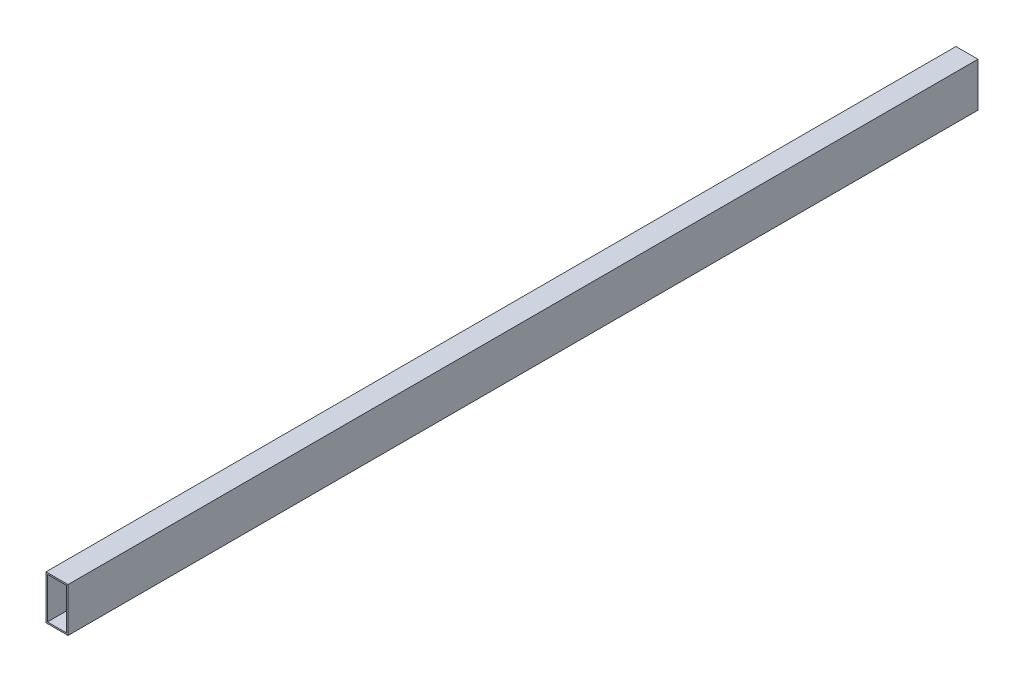
ISO-10303-21;
HEADER;
FILE_DESCRIPTION(('STEP AP214'),'2;1');
FILE_NAME('part.step','',(''),(''),'','','');
FILE_SCHEMA(('AUTOMOTIVE_DESIGN { 1 0 10303 214 1 1 1 1 }'));
ENDSEC;
DATA;
#1=APPLICATION_CONTEXT('core data for automotive mechanical design processes');
#2=APPLICATION_PROTOCOL_DEFINITION('international standard','automotive_design',2000,#1);
#3=PRODUCT_CONTEXT('',#1,'mechanical');
#4=PRODUCT('Part','Part','',(#3));
#5=PRODUCT_RELATED_PRODUCT_CATEGORY('part','',(#4));
#6=PRODUCT_DEFINITION_FORMATION('','',#4);
#7=PRODUCT_DEFINITION_CONTEXT('part definition',#1,'design');
#8=PRODUCT_DEFINITION('design','',#6,#7);
#9=PRODUCT_DEFINITION_SHAPE('','',#8);
#10=(LENGTH_UNIT() NAMED_UNIT(*) SI_UNIT(.MILLI.,.METRE.));
#11=(NAMED_UNIT(*) PLANE_ANGLE_UNIT() SI_UNIT($,.RADIAN.));
#12=(NAMED_UNIT(*) SI_UNIT($,.STERADIAN.) SOLID_ANGLE_UNIT());
#13=UNCERTAINTY_MEASURE_WITH_UNIT(LENGTH_MEASURE(1.E-05),#10,'distance_accuracy_value','');
#14=(GEOMETRIC_REPRESENTATION_CONTEXT(3) GLOBAL_UNCERTAINTY_ASSIGNED_CONTEXT((#13)) GLOBAL_UNIT_ASSIGNED_CONTEXT((#10,
#11,#12)) REPRESENTATION_CONTEXT('',''));
#15=CARTESIAN_POINT('',(0.,0.,0.));
#16=DIRECTION('',(0.,0.,1.));
#17=DIRECTION('',(1.,0.,0.));
#18=AXIS2_PLACEMENT_3D('',#15,#16,#17);
#19=CARTESIAN_POINT('',(-48.4372093023255,-30.1994186046511,1047.75));
#20=DIRECTION('',(1.,0.,0.));
#21=DIRECTION('',(0.,0.,-1.));
#22=AXIS2_PLACEMENT_3D('',#19,#20,#21);
#23=PLANE('',#22);
#24=DIRECTION('',(0.,-1.,0.));
#25=VECTOR('',#24,1.);
#26=CARTESIAN_POINT('',(-48.4372093023255,-30.1994186046511,0.));
#27=LINE('',#26,#25);
#28=CARTESIAN_POINT('',(-48.4372093023255,20.6005813953489,0.));
#29=VERTEX_POINT('',#28);
#30=CARTESIAN_POINT('',(-48.4372093023255,-30.1994186046511,0.));
#31=VERTEX_POINT('',#30);
#32=EDGE_CURVE('E129',#29,#31,#27,.T.);
#33=ORIENTED_EDGE('',*,*,#32,.T.);
#34=DIRECTION('',(0.,0.,-1.));
#35=VECTOR('',#34,1.);
#36=CARTESIAN_POINT('',(-48.4372093023255,-30.1994186046511,1047.75));
#37=LINE('',#36,#35);
#38=CARTESIAN_POINT('',(-48.4372093023255,-30.1994186046511,1047.75));
#39=VERTEX_POINT('',#38);
#40=EDGE_CURVE('E11',#39,#31,#37,.T.);
#41=ORIENTED_EDGE('',*,*,#40,.F.);
#42=DIRECTION('',(0.,-1.,0.));
#43=VECTOR('',#42,1.);
#44=CARTESIAN_POINT('',(-48.4372093023255,-30.1994186046511,1047.75));
#45=LINE('',#44,#43);
#46=CARTESIAN_POINT('',(-48.4372093023255,20.6005813953489,1047.75));
#47=VERTEX_POINT('',#46);
#48=EDGE_CURVE('E133',#47,#39,#45,.T.);
#49=ORIENTED_EDGE('',*,*,#48,.F.);
#50=DIRECTION('',(0.,0.,-1.));
#51=VECTOR('',#50,1.);
#52=CARTESIAN_POINT('',(-48.4372093023255,20.6005813953489,1047.75));
#53=LINE('',#52,#51);
#54=EDGE_CURVE('E143',#47,#29,#53,.T.);
#55=ORIENTED_EDGE('',*,*,#54,.T.);
#56=EDGE_LOOP('',(#33,#41,#49,#55));
#57=FACE_BOUND('',#56,.T.);
#58=ADVANCED_FACE('F32',(#57),#23,.F.);
#59=CARTESIAN_POINT('',(-48.4372093023255,-30.1994186046511,1047.75));
#60=DIRECTION('',(0.,1.,0.));
#61=DIRECTION('',(0.,0.,1.));
#62=AXIS2_PLACEMENT_3D('',#59,#60,#61);
#63=PLANE('',#62);
#64=DIRECTION('',(1.,0.,0.));
#65=VECTOR('',#64,1.);
#66=CARTESIAN_POINT('',(-48.4372093023255,-30.1994186046511,0.));
#67=LINE('',#66,#65);
#68=CARTESIAN_POINT('',(-23.0372093023255,-30.1994186046511,0.));
#69=VERTEX_POINT('',#68);
#70=EDGE_CURVE('E146',#31,#69,#67,.T.);
#71=ORIENTED_EDGE('',*,*,#70,.T.);
#72=DIRECTION('',(0.,0.,-1.));
#73=VECTOR('',#72,1.);
#74=CARTESIAN_POINT('',(-23.0372093023255,-30.1994186046511,1047.75));
#75=LINE('',#74,#73);
#76=CARTESIAN_POINT('',(-23.0372093023255,-30.1994186046511,1047.75));
#77=VERTEX_POINT('',#76);
#78=EDGE_CURVE('E39',#77,#69,#75,.T.);
#79=ORIENTED_EDGE('',*,*,#78,.F.);
#80=DIRECTION('',(1.,0.,0.));
#81=VECTOR('',#80,1.);
#82=CARTESIAN_POINT('',(-48.4372093023255,-30.1994186046511,1047.75));
#83=LINE('',#82,#81);
#84=EDGE_CURVE('E136',#39,#77,#83,.T.);
#85=ORIENTED_EDGE('',*,*,#84,.F.);
#86=ORIENTED_EDGE('',*,*,#40,.T.);
#87=EDGE_LOOP('',(#71,#79,#85,#86));
#88=FACE_BOUND('',#87,.T.);
#89=ADVANCED_FACE('F174',(#88),#63,.F.);
#90=CARTESIAN_POINT('',(-23.0372093023255,-30.1994186046511,1047.75));
#91=DIRECTION('',(-1.,0.,0.));
#92=DIRECTION('',(0.,-1.,0.));
#93=AXIS2_PLACEMENT_3D('',#90,#91,#92);
#94=PLANE('',#93);
#95=DIRECTION('',(0.,1.,0.));
#96=VECTOR('',#95,1.);
#97=CARTESIAN_POINT('',(-23.0372093023255,-30.1994186046511,0.));
#98=LINE('',#97,#96);
#99=CARTESIAN_POINT('',(-23.0372093023255,20.6005813953489,0.));
#100=VERTEX_POINT('',#99);
#101=EDGE_CURVE('E148',#69,#100,#98,.T.);
#102=ORIENTED_EDGE('',*,*,#101,.T.);
#103=DIRECTION('',(0.,0.,-1.));
#104=VECTOR('',#103,1.);
#105=CARTESIAN_POINT('',(-23.0372093023255,20.6005813953489,1047.75));
#106=LINE('',#105,#104);
#107=CARTESIAN_POINT('',(-23.0372093023255,20.6005813953489,1047.75));
#108=VERTEX_POINT('',#107);
#109=EDGE_CURVE('E153',#108,#100,#106,.T.);
#110=ORIENTED_EDGE('',*,*,#109,.F.);
#111=DIRECTION('',(0.,1.,0.));
#112=VECTOR('',#111,1.);
#113=CARTESIAN_POINT('',(-23.0372093023255,-30.1994186046511,1047.75));
#114=LINE('',#113,#112);
#115=EDGE_CURVE('E139',#77,#108,#114,.T.);
#116=ORIENTED_EDGE('',*,*,#115,.F.);
#117=ORIENTED_EDGE('',*,*,#78,.T.);
#118=EDGE_LOOP('',(#102,#110,#116,#117));
#119=FACE_BOUND('',#118,.T.);
#120=ADVANCED_FACE('F160',(#119),#94,.F.);
#121=CARTESIAN_POINT('',(-48.4372093023255,20.6005813953489,1047.75));
#122=DIRECTION('',(0.,-1.,0.));
#123=DIRECTION('',(0.,0.,-1.));
#124=AXIS2_PLACEMENT_3D('',#121,#122,#123);
#125=PLANE('',#124);
#126=DIRECTION('',(-1.,0.,0.));
#127=VECTOR('',#126,1.);
#128=CARTESIAN_POINT('',(-48.4372093023255,20.6005813953489,0.));
#129=LINE('',#128,#127);
#130=EDGE_CURVE('E137',#100,#29,#129,.T.);
#131=ORIENTED_EDGE('',*,*,#130,.T.);
#132=ORIENTED_EDGE('',*,*,#54,.F.);
#133=DIRECTION('',(-1.,0.,0.));
#134=VECTOR('',#133,1.);
#135=CARTESIAN_POINT('',(-48.4372093023255,20.6005813953489,1047.75));
#136=LINE('',#135,#134);
#137=EDGE_CURVE('E141',#108,#47,#136,.T.);
#138=ORIENTED_EDGE('',*,*,#137,.F.);
#139=ORIENTED_EDGE('',*,*,#109,.T.);
#140=EDGE_LOOP('',(#131,#132,#138,#139));
#141=FACE_BOUND('',#140,.T.);
#142=ADVANCED_FACE('F167',(#141),#125,.F.);
#143=CARTESIAN_POINT('',(0.,0.,1047.75));
#144=DIRECTION('',(0.,0.,-1.));
#145=DIRECTION('',(-1.,0.,0.));
#146=AXIS2_PLACEMENT_3D('',#143,#144,#145);
#147=PLANE('',#146);
#148=DIRECTION('',(-1.,0.,0.));
#149=VECTOR('',#148,1.);
#150=CARTESIAN_POINT('',(-46.7862093023255,18.9495813953489,1047.75));
#151=LINE('',#150,#149);
#152=CARTESIAN_POINT('',(-24.6882093023255,18.9495813953489,1047.75));
#153=VERTEX_POINT('',#152);
#154=CARTESIAN_POINT('',(-46.7862093023255,18.9495813953489,1047.75));
#155=VERTEX_POINT('',#154);
#156=EDGE_CURVE('E123',#153,#155,#151,.T.);
#157=ORIENTED_EDGE('',*,*,#156,.F.);
#158=DIRECTION('',(0.,1.,0.));
#159=VECTOR('',#158,1.);
#160=CARTESIAN_POINT('',(-24.6882093023255,18.9495813953489,1047.75));
#161=LINE('',#160,#159);
#162=CARTESIAN_POINT('',(-24.6882093023255,-28.5484186046511,1047.75));
#163=VERTEX_POINT('',#162);
#164=EDGE_CURVE('E46',#163,#153,#161,.T.);
#165=ORIENTED_EDGE('',*,*,#164,.F.);
#166=DIRECTION('',(1.,0.,0.));
#167=VECTOR('',#166,1.);
#168=CARTESIAN_POINT('',(-46.7862093023255,-28.5484186046511,1047.75));
#169=LINE('',#168,#167);
#170=CARTESIAN_POINT('',(-46.7862093023255,-28.5484186046511,1047.75));
#171=VERTEX_POINT('',#170);
#172=EDGE_CURVE('E114',#171,#163,#169,.T.);
#173=ORIENTED_EDGE('',*,*,#172,.F.);
#174=DIRECTION('',(0.,-1.,0.));
#175=VECTOR('',#174,1.);
#176=CARTESIAN_POINT('',(-46.7862093023255,18.9495813953489,1047.75));
#177=LINE('',#176,#175);
#178=EDGE_CURVE('E117',#155,#171,#177,.T.);
#179=ORIENTED_EDGE('',*,*,#178,.F.);
#180=EDGE_LOOP('',(#157,#165,#173,#179));
#181=FACE_BOUND('',#180,.T.);
#182=ORIENTED_EDGE('',*,*,#48,.T.);
#183=ORIENTED_EDGE('',*,*,#84,.T.);
#184=ORIENTED_EDGE('',*,*,#115,.T.);
#185=ORIENTED_EDGE('',*,*,#137,.T.);
#186=EDGE_LOOP('',(#182,#183,#184,#185));
#187=FACE_BOUND('',#186,.T.);
#188=ADVANCED_FACE('F173',(#181,#187),#147,.F.);
#189=CARTESIAN_POINT('',(0.,0.,0.));
#190=DIRECTION('',(0.,0.,-1.));
#191=DIRECTION('',(-1.,0.,0.));
#192=AXIS2_PLACEMENT_3D('',#189,#190,#191);
#193=PLANE('',#192);
#194=DIRECTION('',(0.,1.,0.));
#195=VECTOR('',#194,1.);
#196=CARTESIAN_POINT('',(-24.6882093023255,18.9495813953489,0.));
#197=LINE('',#196,#195);
#198=CARTESIAN_POINT('',(-24.6882093023255,-28.5484186046511,0.));
#199=VERTEX_POINT('',#198);
#200=CARTESIAN_POINT('',(-24.6882093023255,18.9495813953489,0.));
#201=VERTEX_POINT('',#200);
#202=EDGE_CURVE('E98',#199,#201,#197,.T.);
#203=ORIENTED_EDGE('',*,*,#202,.T.);
#204=DIRECTION('',(-1.,0.,0.));
#205=VECTOR('',#204,1.);
#206=CARTESIAN_POINT('',(-46.7862093023255,18.9495813953489,0.));
#207=LINE('',#206,#205);
#208=CARTESIAN_POINT('',(-46.7862093023255,18.9495813953489,0.));
#209=VERTEX_POINT('',#208);
#210=EDGE_CURVE('E107',#201,#209,#207,.T.);
#211=ORIENTED_EDGE('',*,*,#210,.T.);
#212=DIRECTION('',(0.,-1.,0.));
#213=VECTOR('',#212,1.);
#214=CARTESIAN_POINT('',(-46.7862093023255,18.9495813953489,0.));
#215=LINE('',#214,#213);
#216=CARTESIAN_POINT('',(-46.7862093023255,-28.5484186046511,0.));
#217=VERTEX_POINT('',#216);
#218=EDGE_CURVE('E54',#209,#217,#215,.T.);
#219=ORIENTED_EDGE('',*,*,#218,.T.);
#220=DIRECTION('',(1.,0.,0.));
#221=VECTOR('',#220,1.);
#222=CARTESIAN_POINT('',(-46.7862093023255,-28.5484186046511,0.));
#223=LINE('',#222,#221);
#224=EDGE_CURVE('E104',#217,#199,#223,.T.);
#225=ORIENTED_EDGE('',*,*,#224,.T.);
#226=EDGE_LOOP('',(#203,#211,#219,#225));
#227=FACE_BOUND('',#226,.T.);
#228=ORIENTED_EDGE('',*,*,#32,.F.);
#229=ORIENTED_EDGE('',*,*,#130,.F.);
#230=ORIENTED_EDGE('',*,*,#101,.F.);
#231=ORIENTED_EDGE('',*,*,#70,.F.);
#232=EDGE_LOOP('',(#228,#229,#230,#231));
#233=FACE_BOUND('',#232,.T.);
#234=ADVANCED_FACE('F111',(#227,#233),#193,.T.);
#235=CARTESIAN_POINT('',(-24.6882093023255,18.9495813953489,0.));
#236=DIRECTION('',(1.,0.,0.));
#237=DIRECTION('',(0.,1.,0.));
#238=AXIS2_PLACEMENT_3D('',#235,#236,#237);
#239=PLANE('',#238);
#240=ORIENTED_EDGE('',*,*,#164,.T.);
#241=DIRECTION('',(0.,0.,1.));
#242=VECTOR('',#241,1.);
#243=CARTESIAN_POINT('',(-24.6882093023255,18.9495813953489,0.));
#244=LINE('',#243,#242);
#245=EDGE_CURVE('E94',#201,#153,#244,.T.);
#246=ORIENTED_EDGE('',*,*,#245,.F.);
#247=ORIENTED_EDGE('',*,*,#202,.F.);
#248=DIRECTION('',(0.,0.,1.));
#249=VECTOR('',#248,1.);
#250=CARTESIAN_POINT('',(-24.6882093023255,-28.5484186046511,0.));
#251=LINE('',#250,#249);
#252=EDGE_CURVE('E127',#199,#163,#251,.T.);
#253=ORIENTED_EDGE('',*,*,#252,.T.);
#254=EDGE_LOOP('',(#240,#246,#247,#253));
#255=FACE_BOUND('',#254,.T.);
#256=ADVANCED_FACE('F96',(#255),#239,.F.);
#257=CARTESIAN_POINT('',(-46.7862093023255,-28.5484186046511,0.));
#258=DIRECTION('',(0.,-1.,0.));
#259=DIRECTION('',(0.,0.,-1.));
#260=AXIS2_PLACEMENT_3D('',#257,#258,#259);
#261=PLANE('',#260);
#262=ORIENTED_EDGE('',*,*,#172,.T.);
#263=ORIENTED_EDGE('',*,*,#252,.F.);
#264=ORIENTED_EDGE('',*,*,#224,.F.);
#265=DIRECTION('',(0.,0.,1.));
#266=VECTOR('',#265,1.);
#267=CARTESIAN_POINT('',(-46.7862093023255,-28.5484186046511,0.));
#268=LINE('',#267,#266);
#269=EDGE_CURVE('E130',#217,#171,#268,.T.);
#270=ORIENTED_EDGE('',*,*,#269,.T.);
#271=EDGE_LOOP('',(#262,#263,#264,#270));
#272=FACE_BOUND('',#271,.T.);
#273=ADVANCED_FACE('F191',(#272),#261,.F.);
#274=CARTESIAN_POINT('',(-46.7862093023255,18.9495813953489,0.));
#275=DIRECTION('',(-1.,0.,0.));
#276=DIRECTION('',(0.,-1.,0.));
#277=AXIS2_PLACEMENT_3D('',#274,#275,#276);
#278=PLANE('',#277);
#279=ORIENTED_EDGE('',*,*,#178,.T.);
#280=ORIENTED_EDGE('',*,*,#269,.F.);
#281=ORIENTED_EDGE('',*,*,#218,.F.);
#282=DIRECTION('',(0.,0.,1.));
#283=VECTOR('',#282,1.);
#284=CARTESIAN_POINT('',(-46.7862093023255,18.9495813953489,0.));
#285=LINE('',#284,#283);
#286=EDGE_CURVE('E103',#209,#155,#285,.T.);
#287=ORIENTED_EDGE('',*,*,#286,.T.);
#288=EDGE_LOOP('',(#279,#280,#281,#287));
#289=FACE_BOUND('',#288,.T.);
#290=ADVANCED_FACE('F194',(#289),#278,.F.);
#291=CARTESIAN_POINT('',(-46.7862093023255,18.9495813953489,0.));
#292=DIRECTION('',(0.,1.,0.));
#293=DIRECTION('',(0.,0.,1.));
#294=AXIS2_PLACEMENT_3D('',#291,#292,#293);
#295=PLANE('',#294);
#296=ORIENTED_EDGE('',*,*,#156,.T.);
#297=ORIENTED_EDGE('',*,*,#286,.F.);
#298=ORIENTED_EDGE('',*,*,#210,.F.);
#299=ORIENTED_EDGE('',*,*,#245,.T.);
#300=EDGE_LOOP('',(#296,#297,#298,#299));
#301=FACE_BOUND('',#300,.T.);
#302=ADVANCED_FACE('F108',(#301),#295,.F.);
#303=CLOSED_SHELL('',(#58,#89,#120,#142,#188,#234,#256,#273,#290,#302));
#304=MANIFOLD_SOLID_BREP('B2',#303);
#305=ADVANCED_BREP_SHAPE_REPRESENTATION('',(#18,#304),#14);
#306=SHAPE_DEFINITION_REPRESENTATION(#9,#305);
ENDSEC;
END-ISO-10303-21;
